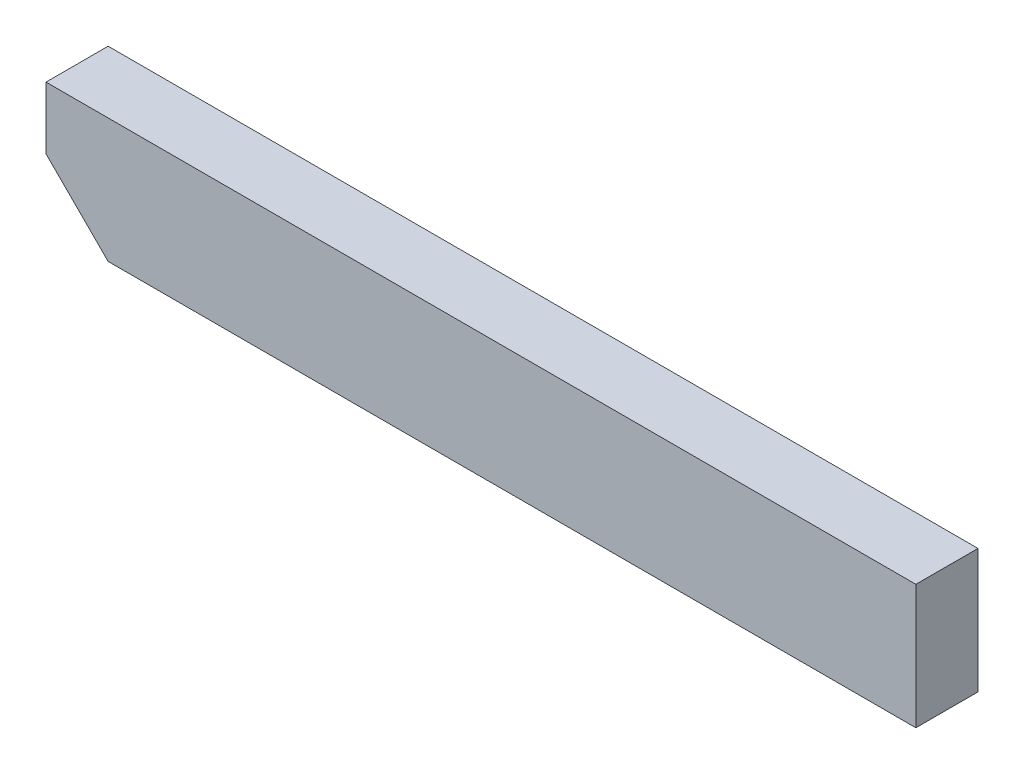
ISO-10303-21;
HEADER;
FILE_DESCRIPTION(('STEP AP214'),'2;1');
FILE_NAME('part.step','',(''),(''),'','','');
FILE_SCHEMA(('AUTOMOTIVE_DESIGN { 1 0 10303 214 1 1 1 1 }'));
ENDSEC;
DATA;
#1=APPLICATION_CONTEXT('core data for automotive mechanical design processes');
#2=APPLICATION_PROTOCOL_DEFINITION('international standard','automotive_design',2000,#1);
#3=PRODUCT_CONTEXT('',#1,'mechanical');
#4=PRODUCT('Part','Part','',(#3));
#5=PRODUCT_RELATED_PRODUCT_CATEGORY('part','',(#4));
#6=PRODUCT_DEFINITION_FORMATION('','',#4);
#7=PRODUCT_DEFINITION_CONTEXT('part definition',#1,'design');
#8=PRODUCT_DEFINITION('design','',#6,#7);
#9=PRODUCT_DEFINITION_SHAPE('','',#8);
#10=(LENGTH_UNIT() NAMED_UNIT(*) SI_UNIT(.MILLI.,.METRE.));
#11=(NAMED_UNIT(*) PLANE_ANGLE_UNIT() SI_UNIT($,.RADIAN.));
#12=(NAMED_UNIT(*) SI_UNIT($,.STERADIAN.) SOLID_ANGLE_UNIT());
#13=UNCERTAINTY_MEASURE_WITH_UNIT(LENGTH_MEASURE(1.E-05),#10,'distance_accuracy_value','');
#14=(GEOMETRIC_REPRESENTATION_CONTEXT(3) GLOBAL_UNCERTAINTY_ASSIGNED_CONTEXT((#13)) GLOBAL_UNIT_ASSIGNED_CONTEXT((#10,
#11,#12)) REPRESENTATION_CONTEXT('',''));
#15=CARTESIAN_POINT('',(0.,0.,0.));
#16=DIRECTION('',(0.,0.,1.));
#17=DIRECTION('',(1.,0.,0.));
#18=AXIS2_PLACEMENT_3D('',#15,#16,#17);
#19=CARTESIAN_POINT('',(-1.4,0.2,0.2));
#20=DIRECTION('',(0.,0.,-1.));
#21=DIRECTION('',(-1.,0.,0.));
#22=AXIS2_PLACEMENT_3D('',#19,#20,#21);
#23=PLANE('',#22);
#24=DIRECTION('',(-0.707106781186548,0.707106781186547,0.));
#25=VECTOR('',#24,1.);
#26=CARTESIAN_POINT('',(-1.2,-0.2,0.2));
#27=LINE('',#26,#25);
#28=CARTESIAN_POINT('',(-1.2,-0.2,0.2));
#29=VERTEX_POINT('',#28);
#30=CARTESIAN_POINT('',(-1.4,0.,0.2));
#31=VERTEX_POINT('',#30);
#32=EDGE_CURVE('E20',#29,#31,#27,.T.);
#33=ORIENTED_EDGE('',*,*,#32,.F.);
#34=DIRECTION('',(1.,0.,0.));
#35=VECTOR('',#34,1.);
#36=CARTESIAN_POINT('',(-1.2,-0.2,0.2));
#37=LINE('',#36,#35);
#38=CARTESIAN_POINT('',(1.4,-0.2,0.2));
#39=VERTEX_POINT('',#38);
#40=EDGE_CURVE('E84',#29,#39,#37,.T.);
#41=ORIENTED_EDGE('',*,*,#40,.T.);
#42=DIRECTION('',(0.,1.,0.));
#43=VECTOR('',#42,1.);
#44=CARTESIAN_POINT('',(1.4,-0.2,0.2));
#45=LINE('',#44,#43);
#46=CARTESIAN_POINT('',(1.4,0.2,0.2));
#47=VERTEX_POINT('',#46);
#48=EDGE_CURVE('E62',#39,#47,#45,.T.);
#49=ORIENTED_EDGE('',*,*,#48,.T.);
#50=DIRECTION('',(1.,0.,0.));
#51=VECTOR('',#50,1.);
#52=CARTESIAN_POINT('',(1.4,0.2,0.2));
#53=LINE('',#52,#51);
#54=CARTESIAN_POINT('',(-1.4,0.2,0.2));
#55=VERTEX_POINT('',#54);
#56=EDGE_CURVE('E77',#47,#55,#53,.F.);
#57=ORIENTED_EDGE('',*,*,#56,.T.);
#58=DIRECTION('',(0.,1.,0.));
#59=VECTOR('',#58,1.);
#60=CARTESIAN_POINT('',(-1.4,0.2,0.2));
#61=LINE('',#60,#59);
#62=EDGE_CURVE('E69',#31,#55,#61,.T.);
#63=ORIENTED_EDGE('',*,*,#62,.F.);
#64=EDGE_LOOP('',(#33,#41,#49,#57,#63));
#65=FACE_BOUND('',#64,.T.);
#66=ADVANCED_FACE('F17',(#65),#23,.F.);
#67=CARTESIAN_POINT('',(1.4,0.2,0.));
#68=DIRECTION('',(0.,-1.,0.));
#69=DIRECTION('',(0.,0.,-1.));
#70=AXIS2_PLACEMENT_3D('',#67,#68,#69);
#71=PLANE('',#70);
#72=DIRECTION('',(0.,0.,-1.));
#73=VECTOR('',#72,1.);
#74=CARTESIAN_POINT('',(-1.4,0.2,0.));
#75=LINE('',#74,#73);
#76=CARTESIAN_POINT('',(-1.4,0.2,0.));
#77=VERTEX_POINT('',#76);
#78=EDGE_CURVE('E75',#77,#55,#75,.F.);
#79=ORIENTED_EDGE('',*,*,#78,.T.);
#80=ORIENTED_EDGE('',*,*,#56,.F.);
#81=DIRECTION('',(0.,0.,1.));
#82=VECTOR('',#81,1.);
#83=CARTESIAN_POINT('',(1.4,0.2,0.));
#84=LINE('',#83,#82);
#85=CARTESIAN_POINT('',(1.4,0.2,0.));
#86=VERTEX_POINT('',#85);
#87=EDGE_CURVE('E82',#47,#86,#84,.F.);
#88=ORIENTED_EDGE('',*,*,#87,.T.);
#89=DIRECTION('',(-1.,0.,0.));
#90=VECTOR('',#89,1.);
#91=CARTESIAN_POINT('',(-1.4,0.2,0.));
#92=LINE('',#91,#90);
#93=EDGE_CURVE('E74',#77,#86,#92,.F.);
#94=ORIENTED_EDGE('',*,*,#93,.F.);
#95=EDGE_LOOP('',(#79,#80,#88,#94));
#96=FACE_BOUND('',#95,.T.);
#97=ADVANCED_FACE('F109',(#96),#71,.F.);
#98=CARTESIAN_POINT('',(1.4,-0.2,0.));
#99=DIRECTION('',(-1.,0.,0.));
#100=DIRECTION('',(0.,0.,1.));
#101=AXIS2_PLACEMENT_3D('',#98,#99,#100);
#102=PLANE('',#101);
#103=ORIENTED_EDGE('',*,*,#87,.F.);
#104=ORIENTED_EDGE('',*,*,#48,.F.);
#105=DIRECTION('',(0.,0.,1.));
#106=VECTOR('',#105,1.);
#107=CARTESIAN_POINT('',(1.4,-0.2,0.));
#108=LINE('',#107,#106);
#109=CARTESIAN_POINT('',(1.4,-0.2,0.));
#110=VERTEX_POINT('',#109);
#111=EDGE_CURVE('E86',#39,#110,#108,.F.);
#112=ORIENTED_EDGE('',*,*,#111,.T.);
#113=DIRECTION('',(0.,1.,0.));
#114=VECTOR('',#113,1.);
#115=CARTESIAN_POINT('',(1.4,0.2,0.));
#116=LINE('',#115,#114);
#117=EDGE_CURVE('E92',#86,#110,#116,.F.);
#118=ORIENTED_EDGE('',*,*,#117,.F.);
#119=EDGE_LOOP('',(#103,#104,#112,#118));
#120=FACE_BOUND('',#119,.T.);
#121=ADVANCED_FACE('F107',(#120),#102,.F.);
#122=CARTESIAN_POINT('',(-1.2,-0.2,0.));
#123=DIRECTION('',(0.,1.,0.));
#124=DIRECTION('',(0.,0.,1.));
#125=AXIS2_PLACEMENT_3D('',#122,#123,#124);
#126=PLANE('',#125);
#127=ORIENTED_EDGE('',*,*,#111,.F.);
#128=ORIENTED_EDGE('',*,*,#40,.F.);
#129=DIRECTION('',(0.,0.,1.));
#130=VECTOR('',#129,1.);
#131=CARTESIAN_POINT('',(-1.2,-0.2,0.));
#132=LINE('',#131,#130);
#133=CARTESIAN_POINT('',(-1.2,-0.2,0.));
#134=VERTEX_POINT('',#133);
#135=EDGE_CURVE('E66',#29,#134,#132,.F.);
#136=ORIENTED_EDGE('',*,*,#135,.T.);
#137=DIRECTION('',(-1.,0.,0.));
#138=VECTOR('',#137,1.);
#139=CARTESIAN_POINT('',(-1.4,-0.2,0.));
#140=LINE('',#139,#138);
#141=EDGE_CURVE('E95',#110,#134,#140,.T.);
#142=ORIENTED_EDGE('',*,*,#141,.F.);
#143=EDGE_LOOP('',(#127,#128,#136,#142));
#144=FACE_BOUND('',#143,.T.);
#145=ADVANCED_FACE('F104',(#144),#126,.F.);
#146=CARTESIAN_POINT('',(-1.4,0.,0.));
#147=DIRECTION('',(0.707106781186548,0.707106781186548,0.));
#148=DIRECTION('',(-0.707106781186548,0.707106781186548,0.));
#149=AXIS2_PLACEMENT_3D('',#146,#147,#148);
#150=PLANE('',#149);
#151=ORIENTED_EDGE('',*,*,#135,.F.);
#152=ORIENTED_EDGE('',*,*,#32,.T.);
#153=DIRECTION('',(0.,0.,-1.));
#154=VECTOR('',#153,1.);
#155=CARTESIAN_POINT('',(-1.4,0.,0.));
#156=LINE('',#155,#154);
#157=CARTESIAN_POINT('',(-1.4,0.,0.));
#158=VERTEX_POINT('',#157);
#159=EDGE_CURVE('E35',#31,#158,#156,.T.);
#160=ORIENTED_EDGE('',*,*,#159,.T.);
#161=DIRECTION('',(-0.707106781186548,0.707106781186547,0.));
#162=VECTOR('',#161,1.);
#163=CARTESIAN_POINT('',(-1.2,-0.2,0.));
#164=LINE('',#163,#162);
#165=EDGE_CURVE('E26',#134,#158,#164,.T.);
#166=ORIENTED_EDGE('',*,*,#165,.F.);
#167=EDGE_LOOP('',(#151,#152,#160,#166));
#168=FACE_BOUND('',#167,.T.);
#169=ADVANCED_FACE('F65',(#168),#150,.F.);
#170=CARTESIAN_POINT('',(-1.4,0.2,0.));
#171=DIRECTION('',(1.,0.,0.));
#172=DIRECTION('',(0.,0.,-1.));
#173=AXIS2_PLACEMENT_3D('',#170,#171,#172);
#174=PLANE('',#173);
#175=ORIENTED_EDGE('',*,*,#159,.F.);
#176=ORIENTED_EDGE('',*,*,#62,.T.);
#177=ORIENTED_EDGE('',*,*,#78,.F.);
#178=DIRECTION('',(0.,1.,0.));
#179=VECTOR('',#178,1.);
#180=CARTESIAN_POINT('',(-1.4,0.2,0.));
#181=LINE('',#180,#179);
#182=EDGE_CURVE('E11',#158,#77,#181,.T.);
#183=ORIENTED_EDGE('',*,*,#182,.F.);
#184=EDGE_LOOP('',(#175,#176,#177,#183));
#185=FACE_BOUND('',#184,.T.);
#186=ADVANCED_FACE('F71',(#185),#174,.F.);
#187=CARTESIAN_POINT('',(-1.4,0.2,0.));
#188=DIRECTION('',(0.,0.,-1.));
#189=DIRECTION('',(-1.,0.,0.));
#190=AXIS2_PLACEMENT_3D('',#187,#188,#189);
#191=PLANE('',#190);
#192=ORIENTED_EDGE('',*,*,#165,.T.);
#193=ORIENTED_EDGE('',*,*,#182,.T.);
#194=ORIENTED_EDGE('',*,*,#93,.T.);
#195=ORIENTED_EDGE('',*,*,#117,.T.);
#196=ORIENTED_EDGE('',*,*,#141,.T.);
#197=EDGE_LOOP('',(#192,#193,#194,#195,#196));
#198=FACE_BOUND('',#197,.T.);
#199=ADVANCED_FACE('F99',(#198),#191,.T.);
#200=CLOSED_SHELL('',(#66,#97,#121,#145,#169,#186,#199));
#201=MANIFOLD_SOLID_BREP('B1',#200);
#202=ADVANCED_BREP_SHAPE_REPRESENTATION('',(#18,#201),#14);
#203=SHAPE_DEFINITION_REPRESENTATION(#9,#202);
ENDSEC;
END-ISO-10303-21;
